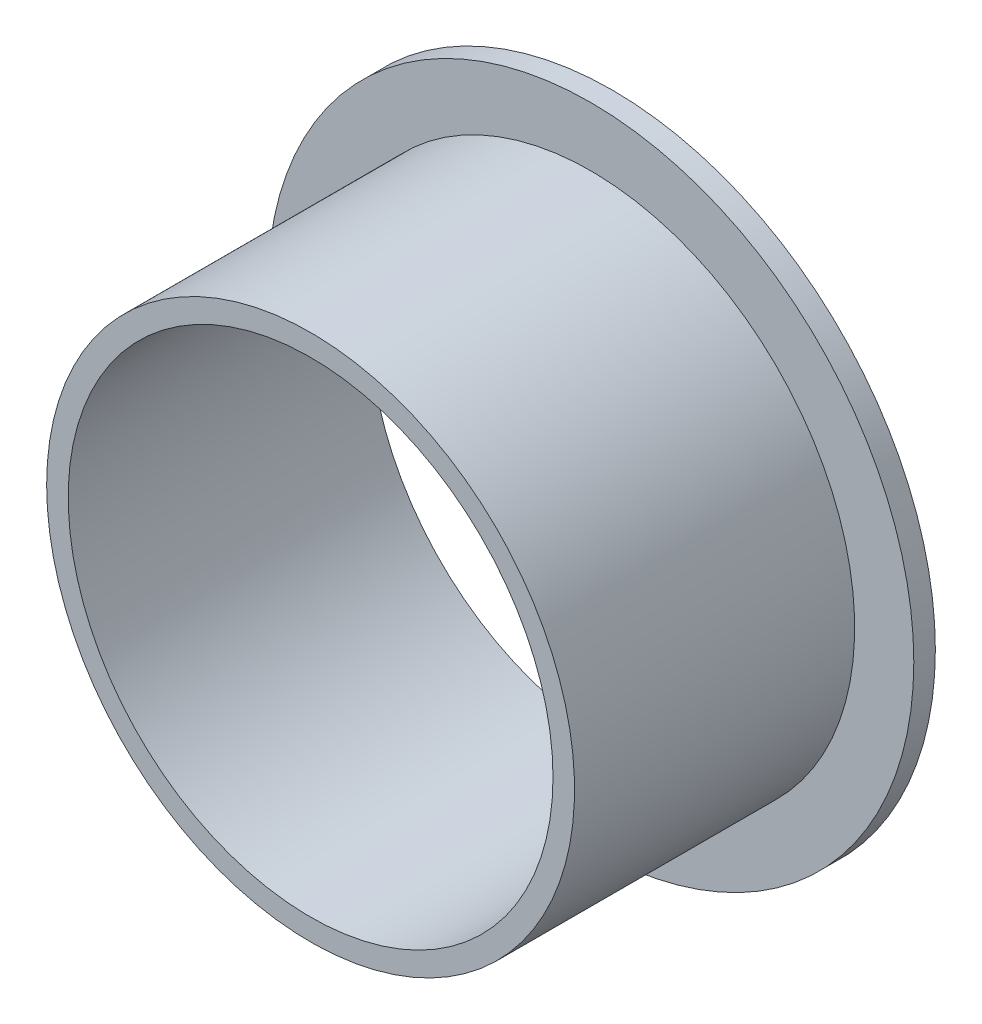
ISO-10303-21;
HEADER;
FILE_DESCRIPTION(('STEP AP214'),'2;1');
FILE_NAME('part.step','',(''),(''),'','','');
FILE_SCHEMA(('AUTOMOTIVE_DESIGN { 1 0 10303 214 1 1 1 1 }'));
ENDSEC;
DATA;
#1=APPLICATION_CONTEXT('core data for automotive mechanical design processes');
#2=APPLICATION_PROTOCOL_DEFINITION('international standard','automotive_design',2000,#1);
#3=PRODUCT_CONTEXT('',#1,'mechanical');
#4=PRODUCT('Part','Part','',(#3));
#5=PRODUCT_RELATED_PRODUCT_CATEGORY('part','',(#4));
#6=PRODUCT_DEFINITION_FORMATION('','',#4);
#7=PRODUCT_DEFINITION_CONTEXT('part definition',#1,'design');
#8=PRODUCT_DEFINITION('design','',#6,#7);
#9=PRODUCT_DEFINITION_SHAPE('','',#8);
#10=(LENGTH_UNIT() NAMED_UNIT(*) SI_UNIT(.MILLI.,.METRE.));
#11=(NAMED_UNIT(*) PLANE_ANGLE_UNIT() SI_UNIT($,.RADIAN.));
#12=(NAMED_UNIT(*) SI_UNIT($,.STERADIAN.) SOLID_ANGLE_UNIT());
#13=UNCERTAINTY_MEASURE_WITH_UNIT(LENGTH_MEASURE(1.E-05),#10,'distance_accuracy_value','');
#14=(GEOMETRIC_REPRESENTATION_CONTEXT(3) GLOBAL_UNCERTAINTY_ASSIGNED_CONTEXT((#13)) GLOBAL_UNIT_ASSIGNED_CONTEXT((#10,
#11,#12)) REPRESENTATION_CONTEXT('',''));
#15=CARTESIAN_POINT('',(0.,0.,0.));
#16=DIRECTION('',(0.,0.,1.));
#17=DIRECTION('',(1.,0.,0.));
#18=AXIS2_PLACEMENT_3D('',#15,#16,#17);
#19=CARTESIAN_POINT('',(0.,0.,4.));
#20=DIRECTION('',(0.,0.,1.));
#21=DIRECTION('',(1.,0.,0.));
#22=AXIS2_PLACEMENT_3D('',#19,#20,#21);
#23=PLANE('',#22);
#24=CARTESIAN_POINT('',(0.,0.,4.));
#25=DIRECTION('',(0.,0.,1.));
#26=DIRECTION('',(1.,0.,0.));
#27=AXIS2_PLACEMENT_3D('',#24,#25,#26);
#28=CIRCLE('',#27,59.9796849406978);
#29=CARTESIAN_POINT('',(59.9796849406978,0.,4.));
#30=VERTEX_POINT('',#29);
#31=EDGE_CURVE('E10',#30,#30,#28,.T.);
#32=ORIENTED_EDGE('',*,*,#31,.T.);
#33=EDGE_LOOP('',(#32));
#34=FACE_BOUND('',#33,.T.);
#35=CARTESIAN_POINT('',(0.,0.,4.));
#36=DIRECTION('',(0.,0.,1.));
#37=DIRECTION('',(1.,0.,0.));
#38=AXIS2_PLACEMENT_3D('',#35,#36,#37);
#39=CIRCLE('',#38,49.);
#40=CARTESIAN_POINT('',(-49.,0.,4.));
#41=VERTEX_POINT('',#40);
#42=EDGE_CURVE('E60',#41,#41,#39,.T.);
#43=ORIENTED_EDGE('',*,*,#42,.F.);
#44=EDGE_LOOP('',(#43));
#45=FACE_BOUND('',#44,.T.);
#46=ADVANCED_FACE('F41',(#34,#45),#23,.T.);
#47=CARTESIAN_POINT('',(0.,0.,0.));
#48=DIRECTION('',(0.,0.,1.));
#49=DIRECTION('',(1.,0.,0.));
#50=AXIS2_PLACEMENT_3D('',#47,#48,#49);
#51=PLANE('',#50);
#52=CARTESIAN_POINT('',(0.,0.,0.));
#53=DIRECTION('',(0.,0.,1.));
#54=DIRECTION('',(1.,0.,0.));
#55=AXIS2_PLACEMENT_3D('',#52,#53,#54);
#56=CIRCLE('',#55,59.9796849406978);
#57=CARTESIAN_POINT('',(59.9796849406978,0.,0.));
#58=VERTEX_POINT('',#57);
#59=EDGE_CURVE('E45',#58,#58,#56,.T.);
#60=ORIENTED_EDGE('',*,*,#59,.F.);
#61=EDGE_LOOP('',(#60));
#62=FACE_BOUND('',#61,.T.);
#63=CARTESIAN_POINT('',(0.,0.,0.));
#64=DIRECTION('',(0.,0.,1.));
#65=DIRECTION('',(1.,0.,0.));
#66=AXIS2_PLACEMENT_3D('',#63,#64,#65);
#67=CIRCLE('',#66,45.);
#68=CARTESIAN_POINT('',(45.,0.,0.));
#69=VERTEX_POINT('',#68);
#70=EDGE_CURVE('E54',#69,#69,#67,.T.);
#71=ORIENTED_EDGE('',*,*,#70,.T.);
#72=EDGE_LOOP('',(#71));
#73=FACE_BOUND('',#72,.T.);
#74=ADVANCED_FACE('F88',(#62,#73),#51,.F.);
#75=CARTESIAN_POINT('',(0.,0.,4.));
#76=DIRECTION('',(0.,0.,-1.));
#77=DIRECTION('',(-1.,0.,0.));
#78=AXIS2_PLACEMENT_3D('',#75,#76,#77);
#79=CYLINDRICAL_SURFACE('',#78,59.9796849406978);
#80=ORIENTED_EDGE('',*,*,#31,.F.);
#81=EDGE_LOOP('',(#80));
#82=FACE_BOUND('',#81,.T.);
#83=ORIENTED_EDGE('',*,*,#59,.T.);
#84=EDGE_LOOP('',(#83));
#85=FACE_BOUND('',#84,.T.);
#86=ADVANCED_FACE('F43',(#82,#85),#79,.T.);
#87=CARTESIAN_POINT('',(0.,0.,4.));
#88=DIRECTION('',(0.,0.,-1.));
#89=DIRECTION('',(-1.,0.,0.));
#90=AXIS2_PLACEMENT_3D('',#87,#88,#89);
#91=CYLINDRICAL_SURFACE('',#90,45.);
#92=ORIENTED_EDGE('',*,*,#70,.F.);
#93=EDGE_LOOP('',(#92));
#94=FACE_BOUND('',#93,.T.);
#95=CARTESIAN_POINT('',(0.,0.,56.));
#96=DIRECTION('',(0.,0.,1.));
#97=DIRECTION('',(1.,0.,0.));
#98=AXIS2_PLACEMENT_3D('',#95,#96,#97);
#99=CIRCLE('',#98,45.);
#100=CARTESIAN_POINT('',(45.,0.,56.));
#101=VERTEX_POINT('',#100);
#102=EDGE_CURVE('E64',#101,#101,#99,.T.);
#103=ORIENTED_EDGE('',*,*,#102,.T.);
#104=EDGE_LOOP('',(#103));
#105=FACE_BOUND('',#104,.T.);
#106=ADVANCED_FACE('F72',(#94,#105),#91,.F.);
#107=CARTESIAN_POINT('',(0.,0.,56.));
#108=DIRECTION('',(0.,0.,1.));
#109=DIRECTION('',(1.,0.,0.));
#110=AXIS2_PLACEMENT_3D('',#107,#108,#109);
#111=PLANE('',#110);
#112=CARTESIAN_POINT('',(0.,0.,56.));
#113=DIRECTION('',(0.,0.,1.));
#114=DIRECTION('',(1.,0.,0.));
#115=AXIS2_PLACEMENT_3D('',#112,#113,#114);
#116=CIRCLE('',#115,49.);
#117=CARTESIAN_POINT('',(-49.,0.,56.));
#118=VERTEX_POINT('',#117);
#119=EDGE_CURVE('E59',#118,#118,#116,.T.);
#120=ORIENTED_EDGE('',*,*,#119,.T.);
#121=EDGE_LOOP('',(#120));
#122=FACE_BOUND('',#121,.T.);
#123=ORIENTED_EDGE('',*,*,#102,.F.);
#124=EDGE_LOOP('',(#123));
#125=FACE_BOUND('',#124,.T.);
#126=ADVANCED_FACE('F74',(#122,#125),#111,.T.);
#127=CARTESIAN_POINT('',(0.,0.,56.));
#128=DIRECTION('',(0.,0.,-1.));
#129=DIRECTION('',(-1.,0.,0.));
#130=AXIS2_PLACEMENT_3D('',#127,#128,#129);
#131=CYLINDRICAL_SURFACE('',#130,49.);
#132=CARTESIAN_POINT('',(-49.,0.,56.));
#133=CARTESIAN_POINT('',(-49.,0.,55.4583333333333));
#134=CARTESIAN_POINT('',(-49.,0.,54.9166666666667));
#135=CARTESIAN_POINT('',(-49.,0.,53.8333333333333));
#136=CARTESIAN_POINT('',(-49.,0.,53.2916666666667));
#137=CARTESIAN_POINT('',(-49.,0.,52.2083333333333));
#138=CARTESIAN_POINT('',(-49.,0.,51.6666666666667));
#139=CARTESIAN_POINT('',(-49.,0.,50.5833333333333));
#140=CARTESIAN_POINT('',(-49.,0.,50.0416666666667));
#141=CARTESIAN_POINT('',(-49.,0.,48.9583333333333));
#142=CARTESIAN_POINT('',(-49.,0.,48.4166666666667));
#143=CARTESIAN_POINT('',(-49.,0.,47.3333333333333));
#144=CARTESIAN_POINT('',(-49.,0.,46.7916666666667));
#145=CARTESIAN_POINT('',(-49.,0.,45.7083333333333));
#146=CARTESIAN_POINT('',(-49.,0.,45.1666666666667));
#147=CARTESIAN_POINT('',(-49.,0.,44.0833333333333));
#148=CARTESIAN_POINT('',(-49.,0.,43.5416666666667));
#149=CARTESIAN_POINT('',(-49.,0.,42.4583333333333));
#150=CARTESIAN_POINT('',(-49.,0.,41.9166666666667));
#151=CARTESIAN_POINT('',(-49.,0.,40.8333333333333));
#152=CARTESIAN_POINT('',(-49.,0.,40.2916666666667));
#153=CARTESIAN_POINT('',(-49.,0.,39.2083333333333));
#154=CARTESIAN_POINT('',(-49.,0.,38.6666666666667));
#155=CARTESIAN_POINT('',(-49.,0.,37.5833333333333));
#156=CARTESIAN_POINT('',(-49.,0.,37.0416666666667));
#157=CARTESIAN_POINT('',(-49.,0.,35.9583333333333));
#158=CARTESIAN_POINT('',(-49.,0.,35.4166666666667));
#159=CARTESIAN_POINT('',(-49.,0.,34.3333333333333));
#160=CARTESIAN_POINT('',(-49.,0.,33.7916666666667));
#161=CARTESIAN_POINT('',(-49.,0.,32.7083333333333));
#162=CARTESIAN_POINT('',(-49.,0.,32.1666666666667));
#163=CARTESIAN_POINT('',(-49.,0.,31.0833333333333));
#164=CARTESIAN_POINT('',(-49.,0.,30.5416666666667));
#165=CARTESIAN_POINT('',(-49.,0.,29.4583333333333));
#166=CARTESIAN_POINT('',(-49.,0.,28.9166666666667));
#167=CARTESIAN_POINT('',(-49.,0.,27.8333333333333));
#168=CARTESIAN_POINT('',(-49.,0.,27.2916666666667));
#169=CARTESIAN_POINT('',(-49.,0.,26.2083333333333));
#170=CARTESIAN_POINT('',(-49.,0.,25.6666666666667));
#171=CARTESIAN_POINT('',(-49.,0.,24.5833333333333));
#172=CARTESIAN_POINT('',(-49.,0.,24.0416666666667));
#173=CARTESIAN_POINT('',(-49.,0.,22.9583333333333));
#174=CARTESIAN_POINT('',(-49.,0.,22.4166666666667));
#175=CARTESIAN_POINT('',(-49.,0.,21.3333333333333));
#176=CARTESIAN_POINT('',(-49.,0.,20.7916666666667));
#177=CARTESIAN_POINT('',(-49.,0.,19.7083333333333));
#178=CARTESIAN_POINT('',(-49.,0.,19.1666666666667));
#179=CARTESIAN_POINT('',(-49.,0.,18.0833333333333));
#180=CARTESIAN_POINT('',(-49.,0.,17.5416666666667));
#181=CARTESIAN_POINT('',(-49.,0.,16.4583333333333));
#182=CARTESIAN_POINT('',(-49.,0.,15.9166666666667));
#183=CARTESIAN_POINT('',(-49.,0.,14.8333333333333));
#184=CARTESIAN_POINT('',(-49.,0.,14.2916666666667));
#185=CARTESIAN_POINT('',(-49.,0.,13.2083333333333));
#186=CARTESIAN_POINT('',(-49.,0.,12.6666666666667));
#187=CARTESIAN_POINT('',(-49.,0.,11.5833333333333));
#188=CARTESIAN_POINT('',(-49.,0.,11.0416666666667));
#189=CARTESIAN_POINT('',(-49.,0.,9.95833333333333));
#190=CARTESIAN_POINT('',(-49.,0.,9.41666666666666));
#191=CARTESIAN_POINT('',(-49.,0.,8.33333333333333));
#192=CARTESIAN_POINT('',(-49.,0.,7.79166666666666));
#193=CARTESIAN_POINT('',(-49.,0.,6.70833333333333));
#194=CARTESIAN_POINT('',(-49.,0.,6.16666666666667));
#195=CARTESIAN_POINT('',(-49.,0.,5.08333333333333));
#196=CARTESIAN_POINT('',(-49.,0.,4.54166666666666));
#197=CARTESIAN_POINT('',(-49.,0.,4.));
#198=B_SPLINE_CURVE_WITH_KNOTS('',3,(#132,#133,#134,#135,#136,#137,#138,#139,#140,#141,#142,
#143,#144,#145,#146,#147,#148,#149,#150,#151,#152,#153,#154,#155,#156,#157,#158,#159,#160,#161,
#162,#163,#164,#165,#166,#167,#168,#169,#170,#171,#172,#173,#174,#175,#176,#177,#178,#179,#180,
#181,#182,#183,#184,#185,#186,#187,#188,#189,#190,#191,#192,#193,#194,#195,#196,#197),
.UNSPECIFIED.,.F.,.F.,(4,2,2,2,2,2,2,2,2,2,2,2,2,2,2,2,2,2,2,2,2,2,2,2,2,2,2,2,2,2,2,2,4),(0.,
1.625,3.25,4.875,6.50000000000001,8.125,9.75,11.375,13.,14.625,16.25,17.875,19.5,21.125,22.75,
24.375,26.,27.625,29.25,30.875,32.5,34.125,35.75,37.375,39.,40.625,42.25,43.875,45.5,47.125,
48.75,50.375,52.),.UNSPECIFIED.);
#199=EDGE_CURVE('BSEAM76',#118,#41,#198,.T.);
#200=ORIENTED_EDGE('',*,*,#119,.F.);
#201=ORIENTED_EDGE('',*,*,#42,.T.);
#202=ORIENTED_EDGE('',*,*,#199,.T.);
#203=ORIENTED_EDGE('',*,*,#199,.F.);
#204=EDGE_LOOP('',(#200,#202,#201,#203));
#205=FACE_BOUND('',#204,.T.);
#206=ADVANCED_FACE('F76',(#205),#131,.T.);
#207=CLOSED_SHELL('',(#46,#74,#86,#106,#126,#206));
#208=MANIFOLD_SOLID_BREP('B2',#207);
#209=ADVANCED_BREP_SHAPE_REPRESENTATION('',(#18,#208),#14);
#210=SHAPE_DEFINITION_REPRESENTATION(#9,#209);
ENDSEC;
END-ISO-10303-21;
